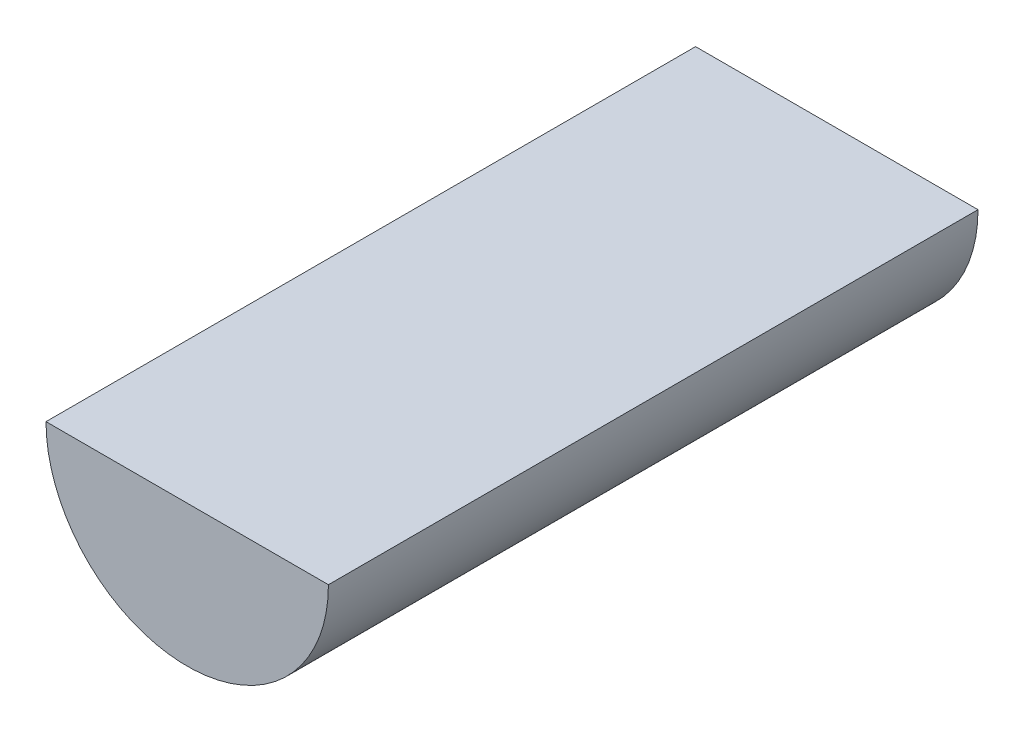
ISO-10303-21;
HEADER;
FILE_DESCRIPTION(('STEP AP214'),'2;1');
FILE_NAME('part.step','',(''),(''),'','','');
FILE_SCHEMA(('AUTOMOTIVE_DESIGN { 1 0 10303 214 1 1 1 1 }'));
ENDSEC;
DATA;
#1=APPLICATION_CONTEXT('core data for automotive mechanical design processes');
#2=APPLICATION_PROTOCOL_DEFINITION('international standard','automotive_design',2000,#1);
#3=PRODUCT_CONTEXT('',#1,'mechanical');
#4=PRODUCT('Part','Part','',(#3));
#5=PRODUCT_RELATED_PRODUCT_CATEGORY('part','',(#4));
#6=PRODUCT_DEFINITION_FORMATION('','',#4);
#7=PRODUCT_DEFINITION_CONTEXT('part definition',#1,'design');
#8=PRODUCT_DEFINITION('design','',#6,#7);
#9=PRODUCT_DEFINITION_SHAPE('','',#8);
#10=(LENGTH_UNIT() NAMED_UNIT(*) SI_UNIT(.MILLI.,.METRE.));
#11=(NAMED_UNIT(*) PLANE_ANGLE_UNIT() SI_UNIT($,.RADIAN.));
#12=(NAMED_UNIT(*) SI_UNIT($,.STERADIAN.) SOLID_ANGLE_UNIT());
#13=UNCERTAINTY_MEASURE_WITH_UNIT(LENGTH_MEASURE(1.E-05),#10,'distance_accuracy_value','');
#14=(GEOMETRIC_REPRESENTATION_CONTEXT(3) GLOBAL_UNCERTAINTY_ASSIGNED_CONTEXT((#13)) GLOBAL_UNIT_ASSIGNED_CONTEXT((#10,
#11,#12)) REPRESENTATION_CONTEXT('',''));
#15=CARTESIAN_POINT('',(0.,0.,0.));
#16=DIRECTION('',(0.,0.,1.));
#17=DIRECTION('',(1.,0.,0.));
#18=AXIS2_PLACEMENT_3D('',#15,#16,#17);
#19=CARTESIAN_POINT('',(0.,0.,230.));
#20=DIRECTION('',(0.,0.,-1.));
#21=DIRECTION('',(-1.,0.,0.));
#22=AXIS2_PLACEMENT_3D('',#19,#20,#21);
#23=CYLINDRICAL_SURFACE('',#22,50.);
#24=CARTESIAN_POINT('',(0.,0.,0.));
#25=DIRECTION('',(0.,0.,1.));
#26=DIRECTION('',(1.,0.,0.));
#27=AXIS2_PLACEMENT_3D('',#24,#25,#26);
#28=CIRCLE('',#27,50.);
#29=CARTESIAN_POINT('',(-50.,0.,0.));
#30=VERTEX_POINT('',#29);
#31=CARTESIAN_POINT('',(50.,0.,0.));
#32=VERTEX_POINT('',#31);
#33=EDGE_CURVE('E76',#30,#32,#28,.T.);
#34=ORIENTED_EDGE('',*,*,#33,.T.);
#35=DIRECTION('',(0.,0.,-1.));
#36=VECTOR('',#35,1.);
#37=CARTESIAN_POINT('',(50.,0.,230.));
#38=LINE('',#37,#36);
#39=CARTESIAN_POINT('',(50.,0.,230.));
#40=VERTEX_POINT('',#39);
#41=EDGE_CURVE('E11',#40,#32,#38,.T.);
#42=ORIENTED_EDGE('',*,*,#41,.F.);
#43=CARTESIAN_POINT('',(0.,0.,230.));
#44=DIRECTION('',(0.,0.,1.));
#45=DIRECTION('',(1.,0.,0.));
#46=AXIS2_PLACEMENT_3D('',#43,#44,#45);
#47=CIRCLE('',#46,50.);
#48=CARTESIAN_POINT('',(-50.,0.,230.));
#49=VERTEX_POINT('',#48);
#50=EDGE_CURVE('E75',#49,#40,#47,.T.);
#51=ORIENTED_EDGE('',*,*,#50,.F.);
#52=DIRECTION('',(0.,0.,-1.));
#53=VECTOR('',#52,1.);
#54=CARTESIAN_POINT('',(-50.,0.,230.));
#55=LINE('',#54,#53);
#56=EDGE_CURVE('E52',#49,#30,#55,.T.);
#57=ORIENTED_EDGE('',*,*,#56,.T.);
#58=EDGE_LOOP('',(#34,#42,#51,#57));
#59=FACE_BOUND('',#58,.T.);
#60=ADVANCED_FACE('F43',(#59),#23,.T.);
#61=CARTESIAN_POINT('',(-50.,0.,230.));
#62=DIRECTION('',(0.,-1.,0.));
#63=DIRECTION('',(0.,0.,-1.));
#64=AXIS2_PLACEMENT_3D('',#61,#62,#63);
#65=PLANE('',#64);
#66=DIRECTION('',(-1.,0.,0.));
#67=VECTOR('',#66,1.);
#68=CARTESIAN_POINT('',(-50.,0.,0.));
#69=LINE('',#68,#67);
#70=EDGE_CURVE('E67',#32,#30,#69,.T.);
#71=ORIENTED_EDGE('',*,*,#70,.T.);
#72=ORIENTED_EDGE('',*,*,#56,.F.);
#73=DIRECTION('',(-1.,0.,0.));
#74=VECTOR('',#73,1.);
#75=CARTESIAN_POINT('',(-50.,0.,230.));
#76=LINE('',#75,#74);
#77=EDGE_CURVE('E59',#40,#49,#76,.T.);
#78=ORIENTED_EDGE('',*,*,#77,.F.);
#79=ORIENTED_EDGE('',*,*,#41,.T.);
#80=EDGE_LOOP('',(#71,#72,#78,#79));
#81=FACE_BOUND('',#80,.T.);
#82=ADVANCED_FACE('F70',(#81),#65,.F.);
#83=CARTESIAN_POINT('',(0.,0.,230.));
#84=DIRECTION('',(0.,0.,1.));
#85=DIRECTION('',(1.,0.,0.));
#86=AXIS2_PLACEMENT_3D('',#83,#84,#85);
#87=PLANE('',#86);
#88=ORIENTED_EDGE('',*,*,#50,.T.);
#89=ORIENTED_EDGE('',*,*,#77,.T.);
#90=EDGE_LOOP('',(#88,#89));
#91=FACE_BOUND('',#90,.T.);
#92=ADVANCED_FACE('F87',(#91),#87,.T.);
#93=CARTESIAN_POINT('',(0.,0.,0.));
#94=DIRECTION('',(0.,0.,1.));
#95=DIRECTION('',(1.,0.,0.));
#96=AXIS2_PLACEMENT_3D('',#93,#94,#95);
#97=PLANE('',#96);
#98=ORIENTED_EDGE('',*,*,#33,.F.);
#99=ORIENTED_EDGE('',*,*,#70,.F.);
#100=EDGE_LOOP('',(#98,#99));
#101=FACE_BOUND('',#100,.T.);
#102=ADVANCED_FACE('F80',(#101),#97,.F.);
#103=CLOSED_SHELL('',(#60,#82,#92,#102));
#104=MANIFOLD_SOLID_BREP('B2',#103);
#105=ADVANCED_BREP_SHAPE_REPRESENTATION('',(#18,#104),#14);
#106=SHAPE_DEFINITION_REPRESENTATION(#9,#105);
ENDSEC;
END-ISO-10303-21;
